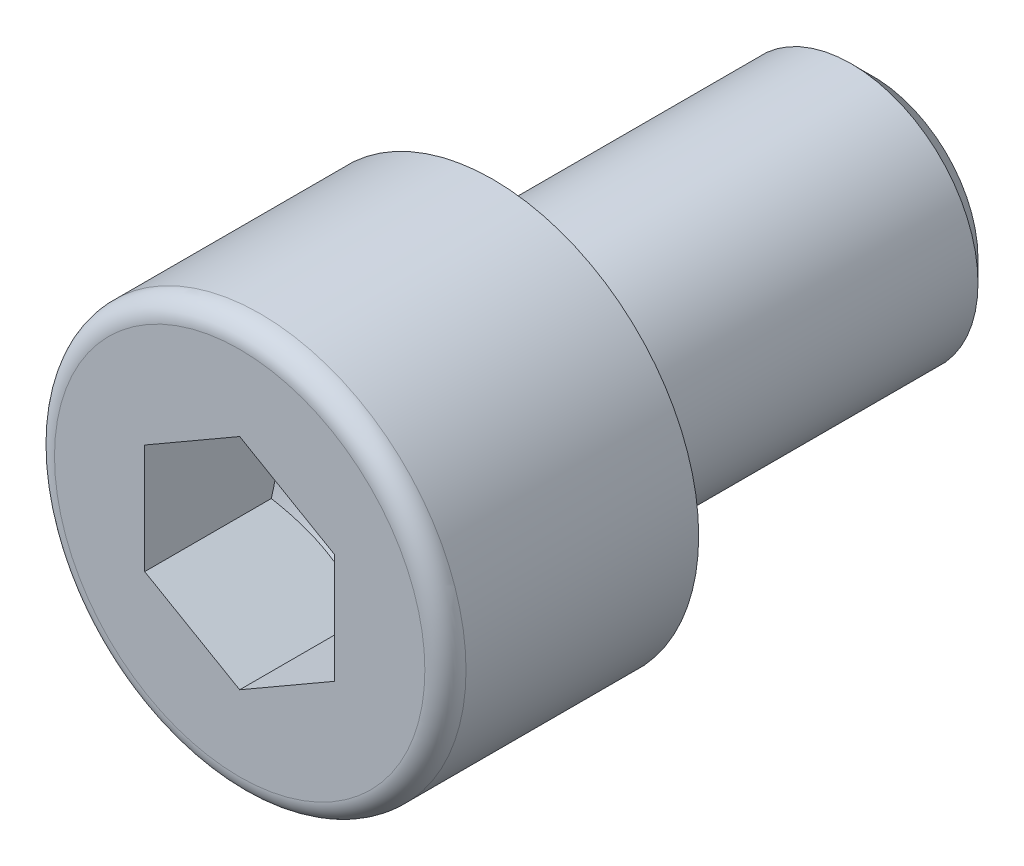
ISO-10303-21;
HEADER;
FILE_DESCRIPTION(('STEP AP214'),'2;1');
FILE_NAME('part.step','',(''),(''),'','','');
FILE_SCHEMA(('AUTOMOTIVE_DESIGN { 1 0 10303 214 1 1 1 1 }'));
ENDSEC;
DATA;
#1=APPLICATION_CONTEXT('core data for automotive mechanical design processes');
#2=APPLICATION_PROTOCOL_DEFINITION('international standard','automotive_design',2000,#1);
#3=PRODUCT_CONTEXT('',#1,'mechanical');
#4=PRODUCT('Part','Part','',(#3));
#5=PRODUCT_RELATED_PRODUCT_CATEGORY('part','',(#4));
#6=PRODUCT_DEFINITION_FORMATION('','',#4);
#7=PRODUCT_DEFINITION_CONTEXT('part definition',#1,'design');
#8=PRODUCT_DEFINITION('design','',#6,#7);
#9=PRODUCT_DEFINITION_SHAPE('','',#8);
#10=(LENGTH_UNIT() NAMED_UNIT(*) SI_UNIT(.MILLI.,.METRE.));
#11=(NAMED_UNIT(*) PLANE_ANGLE_UNIT() SI_UNIT($,.RADIAN.));
#12=(NAMED_UNIT(*) SI_UNIT($,.STERADIAN.) SOLID_ANGLE_UNIT());
#13=UNCERTAINTY_MEASURE_WITH_UNIT(LENGTH_MEASURE(1.E-05),#10,'distance_accuracy_value','');
#14=(GEOMETRIC_REPRESENTATION_CONTEXT(3) GLOBAL_UNCERTAINTY_ASSIGNED_CONTEXT((#13)) GLOBAL_UNIT_ASSIGNED_CONTEXT((#10,
#11,#12)) REPRESENTATION_CONTEXT('',''));
#15=CARTESIAN_POINT('',(0.,0.,0.));
#16=DIRECTION('',(0.,0.,1.));
#17=DIRECTION('',(1.,0.,0.));
#18=AXIS2_PLACEMENT_3D('',#15,#16,#17);
#19=CARTESIAN_POINT('',(-3.25,0.,0.));
#20=DIRECTION('',(0.,0.,-1.));
#21=DIRECTION('',(-1.,0.,0.));
#22=AXIS2_PLACEMENT_3D('',#19,#20,#21);
#23=PLANE('',#22);
#24=CARTESIAN_POINT('',(0.,0.,0.));
#25=DIRECTION('',(0.,0.,-1.));
#26=DIRECTION('',(-1.,0.,0.));
#27=AXIS2_PLACEMENT_3D('',#24,#25,#26);
#28=CIRCLE('',#27,6.5);
#29=CARTESIAN_POINT('',(-6.5,0.,0.));
#30=VERTEX_POINT('',#29);
#31=EDGE_CURVE('E11',#30,#30,#28,.T.);
#32=ORIENTED_EDGE('',*,*,#31,.T.);
#33=EDGE_LOOP('',(#32));
#34=FACE_BOUND('',#33,.T.);
#35=CARTESIAN_POINT('',(0.,0.,0.));
#36=DIRECTION('',(0.,0.,1.));
#37=DIRECTION('',(-1.,0.,0.));
#38=AXIS2_PLACEMENT_3D('',#35,#36,#37);
#39=CIRCLE('',#38,4.);
#40=CARTESIAN_POINT('',(4.,0.,0.));
#41=VERTEX_POINT('',#40);
#42=EDGE_CURVE('E91',#41,#41,#39,.T.);
#43=ORIENTED_EDGE('',*,*,#42,.T.);
#44=EDGE_LOOP('',(#43));
#45=FACE_BOUND('',#44,.T.);
#46=ADVANCED_FACE('F17',(#34,#45),#23,.T.);
#47=CARTESIAN_POINT('',(0.,0.,3.675));
#48=DIRECTION('',(0.,0.,1.));
#49=DIRECTION('',(-1.,0.,0.));
#50=AXIS2_PLACEMENT_3D('',#47,#48,#49);
#51=CYLINDRICAL_SURFACE('',#50,6.5);
#52=CARTESIAN_POINT('',(0.,0.,7.35));
#53=DIRECTION('',(0.,0.,-1.));
#54=DIRECTION('',(-1.,0.,0.));
#55=AXIS2_PLACEMENT_3D('',#52,#53,#54);
#56=CIRCLE('',#55,6.5);
#57=CARTESIAN_POINT('',(-6.5,0.,7.35));
#58=VERTEX_POINT('',#57);
#59=EDGE_CURVE('E29',#58,#58,#56,.T.);
#60=ORIENTED_EDGE('',*,*,#59,.T.);
#61=EDGE_LOOP('',(#60));
#62=FACE_BOUND('',#61,.T.);
#63=ORIENTED_EDGE('',*,*,#31,.F.);
#64=EDGE_LOOP('',(#63));
#65=FACE_BOUND('',#64,.T.);
#66=ADVANCED_FACE('F209',(#62,#65),#51,.T.);
#67=CARTESIAN_POINT('',(0.,0.,7.35));
#68=DIRECTION('',(0.,0.,-1.));
#69=DIRECTION('',(0.,-1.,0.));
#70=AXIS2_PLACEMENT_3D('',#67,#68,#69);
#71=TOROIDAL_SURFACE('',#70,5.85,0.65);
#72=CARTESIAN_POINT('',(0.,0.,8.));
#73=DIRECTION('',(0.,0.,-1.));
#74=DIRECTION('',(-1.,0.,0.));
#75=AXIS2_PLACEMENT_3D('',#72,#73,#74);
#76=CIRCLE('',#75,5.85);
#77=CARTESIAN_POINT('',(-5.85,0.,8.));
#78=VERTEX_POINT('',#77);
#79=EDGE_CURVE('E138',#78,#78,#76,.T.);
#80=ORIENTED_EDGE('',*,*,#79,.T.);
#81=EDGE_LOOP('',(#80));
#82=FACE_BOUND('',#81,.T.);
#83=ORIENTED_EDGE('',*,*,#59,.F.);
#84=EDGE_LOOP('',(#83));
#85=FACE_BOUND('',#84,.T.);
#86=ADVANCED_FACE('F19',(#82,#85),#71,.T.);
#87=CARTESIAN_POINT('',(-2.925,0.,8.));
#88=DIRECTION('',(0.,0.,1.));
#89=DIRECTION('',(1.,0.,0.));
#90=AXIS2_PLACEMENT_3D('',#87,#88,#89);
#91=PLANE('',#90);
#92=ORIENTED_EDGE('',*,*,#79,.F.);
#93=EDGE_LOOP('',(#92));
#94=FACE_BOUND('',#93,.T.);
#95=DIRECTION('',(-0.866025403784439,-0.5,0.));
#96=VECTOR('',#95,1.);
#97=CARTESIAN_POINT('',(0.403124300624837,-3.23135607651737,8.));
#98=LINE('',#97,#96);
#99=CARTESIAN_POINT('',(2.99999860124967,-1.73205,8.));
#100=VERTEX_POINT('',#99);
#101=CARTESIAN_POINT('',(0.,-3.4641,8.));
#102=VERTEX_POINT('',#101);
#103=EDGE_CURVE('E173',#100,#102,#98,.T.);
#104=ORIENTED_EDGE('',*,*,#103,.T.);
#105=DIRECTION('',(-0.866025403784439,0.5,0.));
#106=VECTOR('',#105,1.);
#107=CARTESIAN_POINT('',(-2.59687430062483,-1.96479392348263,8.));
#108=LINE('',#107,#106);
#109=CARTESIAN_POINT('',(-2.99999860124967,-1.73205,8.));
#110=VERTEX_POINT('',#109);
#111=EDGE_CURVE('E131',#102,#110,#108,.T.);
#112=ORIENTED_EDGE('',*,*,#111,.T.);
#113=DIRECTION('',(0.,1.,0.));
#114=VECTOR('',#113,1.);
#115=CARTESIAN_POINT('',(-2.99999860124967,0.,8.));
#116=LINE('',#115,#114);
#117=CARTESIAN_POINT('',(-2.99999860124967,1.73205,8.));
#118=VERTEX_POINT('',#117);
#119=EDGE_CURVE('E110',#110,#118,#116,.T.);
#120=ORIENTED_EDGE('',*,*,#119,.T.);
#121=DIRECTION('',(0.866025403784439,0.5,0.));
#122=VECTOR('',#121,1.);
#123=CARTESIAN_POINT('',(-2.59687430062483,1.96479392348263,8.));
#124=LINE('',#123,#122);
#125=CARTESIAN_POINT('',(0.,3.4641,8.));
#126=VERTEX_POINT('',#125);
#127=EDGE_CURVE('E107',#118,#126,#124,.T.);
#128=ORIENTED_EDGE('',*,*,#127,.T.);
#129=DIRECTION('',(0.866025403784439,-0.5,0.));
#130=VECTOR('',#129,1.);
#131=CARTESIAN_POINT('',(0.403124300624837,3.23135607651737,8.));
#132=LINE('',#131,#130);
#133=CARTESIAN_POINT('',(2.99999860124967,1.73205,8.));
#134=VERTEX_POINT('',#133);
#135=EDGE_CURVE('E77',#126,#134,#132,.T.);
#136=ORIENTED_EDGE('',*,*,#135,.T.);
#137=DIRECTION('',(0.,-1.,0.));
#138=VECTOR('',#137,1.);
#139=CARTESIAN_POINT('',(2.99999860124967,0.,8.));
#140=LINE('',#139,#138);
#141=EDGE_CURVE('E72',#134,#100,#140,.T.);
#142=ORIENTED_EDGE('',*,*,#141,.T.);
#143=EDGE_LOOP('',(#104,#112,#120,#128,#136,#142));
#144=FACE_BOUND('',#143,.T.);
#145=ADVANCED_FACE('F188',(#94,#144),#91,.T.);
#146=CARTESIAN_POINT('',(-1.66171875,0.,-12.));
#147=DIRECTION('',(0.,0.,-1.));
#148=DIRECTION('',(-1.,0.,0.));
#149=AXIS2_PLACEMENT_3D('',#146,#147,#148);
#150=PLANE('',#149);
#151=CARTESIAN_POINT('',(0.,0.,-12.));
#152=DIRECTION('',(0.,0.,-1.));
#153=DIRECTION('',(-1.,0.,0.));
#154=AXIS2_PLACEMENT_3D('',#151,#152,#153);
#155=CIRCLE('',#154,3.3234375);
#156=CARTESIAN_POINT('',(-3.3234375,0.,-12.));
#157=VERTEX_POINT('',#156);
#158=EDGE_CURVE('E87',#157,#157,#155,.T.);
#159=ORIENTED_EDGE('',*,*,#158,.T.);
#160=EDGE_LOOP('',(#159));
#161=FACE_BOUND('',#160,.T.);
#162=ADVANCED_FACE('F222',(#161),#150,.T.);
#163=CARTESIAN_POINT('',(0.,0.,-11.66171875));
#164=DIRECTION('',(0.,0.,1.));
#165=DIRECTION('',(-1.,0.,0.));
#166=AXIS2_PLACEMENT_3D('',#163,#164,#165);
#167=CONICAL_SURFACE('',#166,3.66171875,0.785398163397449);
#168=CARTESIAN_POINT('',(0.,0.,-11.3234375));
#169=DIRECTION('',(0.,0.,-1.));
#170=DIRECTION('',(-1.,0.,0.));
#171=AXIS2_PLACEMENT_3D('',#168,#169,#170);
#172=CIRCLE('',#171,4.);
#173=CARTESIAN_POINT('',(-4.,0.,-11.3234375));
#174=VERTEX_POINT('',#173);
#175=EDGE_CURVE('E168',#174,#174,#172,.T.);
#176=ORIENTED_EDGE('',*,*,#175,.T.);
#177=EDGE_LOOP('',(#176));
#178=FACE_BOUND('',#177,.T.);
#179=ORIENTED_EDGE('',*,*,#158,.F.);
#180=EDGE_LOOP('',(#179));
#181=FACE_BOUND('',#180,.T.);
#182=ADVANCED_FACE('F224',(#178,#181),#167,.T.);
#183=CARTESIAN_POINT('',(0.,0.,-5.16171875));
#184=DIRECTION('',(0.,0.,1.));
#185=DIRECTION('',(-1.,0.,0.));
#186=AXIS2_PLACEMENT_3D('',#183,#184,#185);
#187=CYLINDRICAL_SURFACE('',#186,4.);
#188=ORIENTED_EDGE('',*,*,#42,.F.);
#189=EDGE_LOOP('',(#188));
#190=FACE_BOUND('',#189,.T.);
#191=ORIENTED_EDGE('',*,*,#175,.F.);
#192=EDGE_LOOP('',(#191));
#193=FACE_BOUND('',#192,.T.);
#194=ADVANCED_FACE('F216',(#190,#193),#187,.T.);
#195=CARTESIAN_POINT('',(-1.49999930062484,-2.598075,8.));
#196=DIRECTION('',(-0.5,-0.866025403784439,0.));
#197=DIRECTION('',(-0.866025403784439,0.5,0.));
#198=AXIS2_PLACEMENT_3D('',#195,#196,#197);
#199=PLANE('',#198);
#200=CARTESIAN_POINT('',(0.,-3.4641,4.));
#201=CARTESIAN_POINT('',(-1.49999930062483,-2.598075,3.50000023312505));
#202=CARTESIAN_POINT('',(-2.99999860124967,-1.73205,4.));
#203=(BOUNDED_CURVE() B_SPLINE_CURVE(2,(#200,#201,#202),.UNSPECIFIED.,.F.,
.F.) B_SPLINE_CURVE_WITH_KNOTS((3,3),(0.,3.50530677988333),
.UNSPECIFIED.) CURVE() GEOMETRIC_REPRESENTATION_ITEM() RATIONAL_B_SPLINE_CURVE((1.,
1.15470053837925,1.)) REPRESENTATION_ITEM(''));
#204=CARTESIAN_POINT('',(0.,-3.4641,4.));
#205=VERTEX_POINT('',#204);
#206=CARTESIAN_POINT('',(-2.99999860124967,-1.73205,4.));
#207=VERTEX_POINT('',#206);
#208=EDGE_CURVE('E21',#205,#207,#203,.T.);
#209=ORIENTED_EDGE('',*,*,#208,.T.);
#210=DIRECTION('',(0.,0.,-1.));
#211=VECTOR('',#210,1.);
#212=CARTESIAN_POINT('',(-2.99999860124967,-1.73205,8.));
#213=LINE('',#212,#211);
#214=EDGE_CURVE('E116',#110,#207,#213,.T.);
#215=ORIENTED_EDGE('',*,*,#214,.F.);
#216=ORIENTED_EDGE('',*,*,#111,.F.);
#217=DIRECTION('',(0.,0.,-1.));
#218=VECTOR('',#217,1.);
#219=CARTESIAN_POINT('',(0.,-3.4641,8.));
#220=LINE('',#219,#218);
#221=EDGE_CURVE('E158',#102,#205,#220,.T.);
#222=ORIENTED_EDGE('',*,*,#221,.T.);
#223=EDGE_LOOP('',(#209,#215,#216,#222));
#224=FACE_BOUND('',#223,.T.);
#225=ADVANCED_FACE('F191',(#224),#199,.F.);
#226=CARTESIAN_POINT('',(-2.99999860124967,0.,8.));
#227=DIRECTION('',(-1.,0.,0.));
#228=DIRECTION('',(0.,1.,0.));
#229=AXIS2_PLACEMENT_3D('',#226,#227,#228);
#230=PLANE('',#229);
#231=CARTESIAN_POINT('',(-2.99999860124967,-1.73205,4.));
#232=CARTESIAN_POINT('',(-2.99999860124967,0.,3.50000023312505));
#233=CARTESIAN_POINT('',(-2.99999860124967,1.73205,4.));
#234=(BOUNDED_CURVE() B_SPLINE_CURVE(2,(#231,#232,#233),.UNSPECIFIED.,.F.,
.F.) B_SPLINE_CURVE_WITH_KNOTS((3,3),(0.,3.50530677988333),
.UNSPECIFIED.) CURVE() GEOMETRIC_REPRESENTATION_ITEM() RATIONAL_B_SPLINE_CURVE((1.,
1.15470053837925,1.)) REPRESENTATION_ITEM(''));
#235=CARTESIAN_POINT('',(-2.99999860124967,1.73205,4.));
#236=VERTEX_POINT('',#235);
#237=EDGE_CURVE('E113',#207,#236,#234,.T.);
#238=ORIENTED_EDGE('',*,*,#237,.T.);
#239=DIRECTION('',(0.,0.,-1.));
#240=VECTOR('',#239,1.);
#241=CARTESIAN_POINT('',(-2.99999860124967,1.73205,8.));
#242=LINE('',#241,#240);
#243=EDGE_CURVE('E101',#118,#236,#242,.T.);
#244=ORIENTED_EDGE('',*,*,#243,.F.);
#245=ORIENTED_EDGE('',*,*,#119,.F.);
#246=ORIENTED_EDGE('',*,*,#214,.T.);
#247=EDGE_LOOP('',(#238,#244,#245,#246));
#248=FACE_BOUND('',#247,.T.);
#249=ADVANCED_FACE('F114',(#248),#230,.F.);
#250=CARTESIAN_POINT('',(-1.49999930062484,2.598075,8.));
#251=DIRECTION('',(-0.5,0.866025403784439,0.));
#252=DIRECTION('',(0.866025403784439,0.5,0.));
#253=AXIS2_PLACEMENT_3D('',#250,#251,#252);
#254=PLANE('',#253);
#255=CARTESIAN_POINT('',(-2.99999860124967,1.73205,4.));
#256=CARTESIAN_POINT('',(-1.49999930062484,2.598075,3.50000023312506));
#257=CARTESIAN_POINT('',(0.,3.4641,4.));
#258=(BOUNDED_CURVE() B_SPLINE_CURVE(2,(#255,#256,#257),.UNSPECIFIED.,.F.,
.F.) B_SPLINE_CURVE_WITH_KNOTS((3,3),(0.,3.50530677988333),
.UNSPECIFIED.) CURVE() GEOMETRIC_REPRESENTATION_ITEM() RATIONAL_B_SPLINE_CURVE((1.,
1.15470053837925,1.)) REPRESENTATION_ITEM(''));
#259=CARTESIAN_POINT('',(0.,3.4641,4.));
#260=VERTEX_POINT('',#259);
#261=EDGE_CURVE('E106',#236,#260,#258,.T.);
#262=ORIENTED_EDGE('',*,*,#261,.T.);
#263=DIRECTION('',(0.,0.,-1.));
#264=VECTOR('',#263,1.);
#265=CARTESIAN_POINT('',(0.,3.4641,8.));
#266=LINE('',#265,#264);
#267=EDGE_CURVE('E136',#126,#260,#266,.T.);
#268=ORIENTED_EDGE('',*,*,#267,.F.);
#269=ORIENTED_EDGE('',*,*,#127,.F.);
#270=ORIENTED_EDGE('',*,*,#243,.T.);
#271=EDGE_LOOP('',(#262,#268,#269,#270));
#272=FACE_BOUND('',#271,.T.);
#273=ADVANCED_FACE('F103',(#272),#254,.F.);
#274=CARTESIAN_POINT('',(1.49999930062484,2.598075,8.));
#275=DIRECTION('',(0.5,0.866025403784439,0.));
#276=DIRECTION('',(0.866025403784439,-0.5,0.));
#277=AXIS2_PLACEMENT_3D('',#274,#275,#276);
#278=PLANE('',#277);
#279=CARTESIAN_POINT('',(0.,3.4641,4.));
#280=CARTESIAN_POINT('',(1.49999930062484,2.598075,3.50000023312505));
#281=CARTESIAN_POINT('',(2.99999860124967,1.73205,4.));
#282=(BOUNDED_CURVE() B_SPLINE_CURVE(2,(#279,#280,#281),.UNSPECIFIED.,.F.,
.F.) B_SPLINE_CURVE_WITH_KNOTS((3,3),(0.,3.50530677988332),
.UNSPECIFIED.) CURVE() GEOMETRIC_REPRESENTATION_ITEM() RATIONAL_B_SPLINE_CURVE((1.,
1.15470053837925,1.)) REPRESENTATION_ITEM(''));
#283=CARTESIAN_POINT('',(2.99999860124967,1.73205,4.));
#284=VERTEX_POINT('',#283);
#285=EDGE_CURVE('E125',#260,#284,#282,.T.);
#286=ORIENTED_EDGE('',*,*,#285,.T.);
#287=DIRECTION('',(0.,0.,-1.));
#288=VECTOR('',#287,1.);
#289=CARTESIAN_POINT('',(2.99999860124967,1.73205,8.));
#290=LINE('',#289,#288);
#291=EDGE_CURVE('E137',#134,#284,#290,.T.);
#292=ORIENTED_EDGE('',*,*,#291,.F.);
#293=ORIENTED_EDGE('',*,*,#135,.F.);
#294=ORIENTED_EDGE('',*,*,#267,.T.);
#295=EDGE_LOOP('',(#286,#292,#293,#294));
#296=FACE_BOUND('',#295,.T.);
#297=ADVANCED_FACE('F197',(#296),#278,.F.);
#298=CARTESIAN_POINT('',(2.99999860124967,0.,8.));
#299=DIRECTION('',(1.,0.,0.));
#300=DIRECTION('',(0.,-1.,0.));
#301=AXIS2_PLACEMENT_3D('',#298,#299,#300);
#302=PLANE('',#301);
#303=CARTESIAN_POINT('',(2.99999860124967,1.73205,4.));
#304=CARTESIAN_POINT('',(2.99999860124969,0.,3.50000023312506));
#305=CARTESIAN_POINT('',(2.99999860124967,-1.73205,4.));
#306=(BOUNDED_CURVE() B_SPLINE_CURVE(2,(#303,#304,#305),.UNSPECIFIED.,.F.,
.F.) B_SPLINE_CURVE_WITH_KNOTS((3,3),(0.,3.50530677988333),
.UNSPECIFIED.) CURVE() GEOMETRIC_REPRESENTATION_ITEM() RATIONAL_B_SPLINE_CURVE((1.,
1.15470053837924,1.)) REPRESENTATION_ITEM(''));
#307=CARTESIAN_POINT('',(2.99999860124967,-1.73205,4.));
#308=VERTEX_POINT('',#307);
#309=EDGE_CURVE('E147',#284,#308,#306,.T.);
#310=ORIENTED_EDGE('',*,*,#309,.T.);
#311=DIRECTION('',(0.,0.,-1.));
#312=VECTOR('',#311,1.);
#313=CARTESIAN_POINT('',(2.99999860124967,-1.73205,8.));
#314=LINE('',#313,#312);
#315=EDGE_CURVE('E174',#100,#308,#314,.T.);
#316=ORIENTED_EDGE('',*,*,#315,.F.);
#317=ORIENTED_EDGE('',*,*,#141,.F.);
#318=ORIENTED_EDGE('',*,*,#291,.T.);
#319=EDGE_LOOP('',(#310,#316,#317,#318));
#320=FACE_BOUND('',#319,.T.);
#321=ADVANCED_FACE('F195',(#320),#302,.F.);
#322=CARTESIAN_POINT('',(1.49999930062484,-2.598075,8.));
#323=DIRECTION('',(0.5,-0.866025403784439,0.));
#324=DIRECTION('',(-0.866025403784439,-0.5,0.));
#325=AXIS2_PLACEMENT_3D('',#322,#323,#324);
#326=PLANE('',#325);
#327=CARTESIAN_POINT('',(2.99999860124967,-1.73205,4.));
#328=CARTESIAN_POINT('',(1.49999930062485,-2.598075,3.50000023312506));
#329=CARTESIAN_POINT('',(0.,-3.4641,4.));
#330=(BOUNDED_CURVE() B_SPLINE_CURVE(2,(#327,#328,#329),.UNSPECIFIED.,.F.,
.F.) B_SPLINE_CURVE_WITH_KNOTS((3,3),(0.,3.50530677988333),
.UNSPECIFIED.) CURVE() GEOMETRIC_REPRESENTATION_ITEM() RATIONAL_B_SPLINE_CURVE((1.,
1.15470053837924,1.)) REPRESENTATION_ITEM(''));
#331=EDGE_CURVE('E151',#308,#205,#330,.T.);
#332=ORIENTED_EDGE('',*,*,#331,.T.);
#333=ORIENTED_EDGE('',*,*,#221,.F.);
#334=ORIENTED_EDGE('',*,*,#103,.F.);
#335=ORIENTED_EDGE('',*,*,#315,.T.);
#336=EDGE_LOOP('',(#332,#333,#334,#335));
#337=FACE_BOUND('',#336,.T.);
#338=ADVANCED_FACE('F205',(#337),#326,.F.);
#339=CARTESIAN_POINT('',(0.,0.,3.00000046625011));
#340=DIRECTION('',(0.,0.,1.));
#341=DIRECTION('',(-1.,0.,0.));
#342=AXIS2_PLACEMENT_3D('',#339,#340,#341);
#343=CONICAL_SURFACE('',#342,1.73205,1.0471975511966);
#344=CARTESIAN_POINT('',(0.,0.,2.00000093250022));
#345=VERTEX_POINT('',#344);
#346=VERTEX_LOOP('',#345);
#347=FACE_BOUND('',#346,.T.);
#348=ORIENTED_EDGE('',*,*,#261,.F.);
#349=ORIENTED_EDGE('',*,*,#237,.F.);
#350=ORIENTED_EDGE('',*,*,#208,.F.);
#351=ORIENTED_EDGE('',*,*,#331,.F.);
#352=ORIENTED_EDGE('',*,*,#309,.F.);
#353=ORIENTED_EDGE('',*,*,#285,.F.);
#354=EDGE_LOOP('',(#348,#349,#350,#351,#352,#353));
#355=FACE_BOUND('',#354,.T.);
#356=ADVANCED_FACE('F122',(#347,#355),#343,.F.);
#357=CLOSED_SHELL('',(#46,#66,#86,#145,#162,#182,#194,#225,#249,#273,#297,#321,#338,#356));
#358=MANIFOLD_SOLID_BREP('B1',#357);
#359=ADVANCED_BREP_SHAPE_REPRESENTATION('',(#18,#358),#14);
#360=SHAPE_DEFINITION_REPRESENTATION(#9,#359);
ENDSEC;
END-ISO-10303-21;
